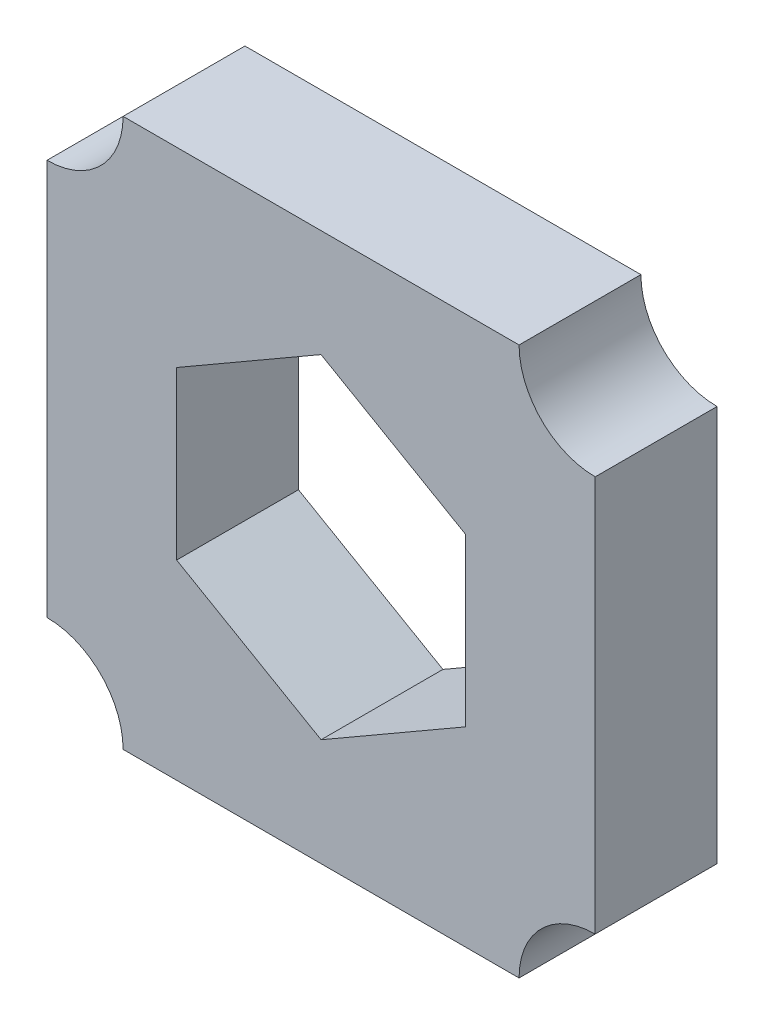
ISO-10303-21;
HEADER;
FILE_DESCRIPTION(('STEP AP214'),'2;1');
FILE_NAME('part.step','',(''),(''),'','','');
FILE_SCHEMA(('AUTOMOTIVE_DESIGN { 1 0 10303 214 1 1 1 1 }'));
ENDSEC;
DATA;
#1=APPLICATION_CONTEXT('core data for automotive mechanical design processes');
#2=APPLICATION_PROTOCOL_DEFINITION('international standard','automotive_design',2000,#1);
#3=PRODUCT_CONTEXT('',#1,'mechanical');
#4=PRODUCT('Part','Part','',(#3));
#5=PRODUCT_RELATED_PRODUCT_CATEGORY('part','',(#4));
#6=PRODUCT_DEFINITION_FORMATION('','',#4);
#7=PRODUCT_DEFINITION_CONTEXT('part definition',#1,'design');
#8=PRODUCT_DEFINITION('design','',#6,#7);
#9=PRODUCT_DEFINITION_SHAPE('','',#8);
#10=(LENGTH_UNIT() NAMED_UNIT(*) SI_UNIT(.MILLI.,.METRE.));
#11=(NAMED_UNIT(*) PLANE_ANGLE_UNIT() SI_UNIT($,.RADIAN.));
#12=(NAMED_UNIT(*) SI_UNIT($,.STERADIAN.) SOLID_ANGLE_UNIT());
#13=UNCERTAINTY_MEASURE_WITH_UNIT(LENGTH_MEASURE(1.E-05),#10,'distance_accuracy_value','');
#14=(GEOMETRIC_REPRESENTATION_CONTEXT(3) GLOBAL_UNCERTAINTY_ASSIGNED_CONTEXT((#13)) GLOBAL_UNIT_ASSIGNED_CONTEXT((#10,
#11,#12)) REPRESENTATION_CONTEXT('',''));
#15=CARTESIAN_POINT('',(0.,0.,0.));
#16=DIRECTION('',(0.,0.,1.));
#17=DIRECTION('',(1.,0.,0.));
#18=AXIS2_PLACEMENT_3D('',#15,#16,#17);
#19=CARTESIAN_POINT('',(90.,90.,10.));
#20=DIRECTION('',(0.,0.,1.));
#21=DIRECTION('',(1.,0.,0.));
#22=AXIS2_PLACEMENT_3D('',#19,#20,#21);
#23=PLANE('',#22);
#24=CARTESIAN_POINT('',(90.,90.,10.));
#25=DIRECTION('',(0.,0.,-1.));
#26=DIRECTION('',(1.,0.,0.));
#27=AXIS2_PLACEMENT_3D('',#24,#25,#26);
#28=CIRCLE('',#27,12.5);
#29=CARTESIAN_POINT('',(90.,77.5,10.));
#30=VERTEX_POINT('',#29);
#31=CARTESIAN_POINT('',(77.5,90.,10.));
#32=VERTEX_POINT('',#31);
#33=EDGE_CURVE('E185',#30,#32,#28,.T.);
#34=ORIENTED_EDGE('',*,*,#33,.T.);
#35=DIRECTION('',(-1.,0.,0.));
#36=VECTOR('',#35,1.);
#37=CARTESIAN_POINT('',(12.5,90.,10.));
#38=LINE('',#37,#36);
#39=CARTESIAN_POINT('',(12.5,90.,10.));
#40=VERTEX_POINT('',#39);
#41=EDGE_CURVE('E188',#32,#40,#38,.T.);
#42=ORIENTED_EDGE('',*,*,#41,.T.);
#43=CARTESIAN_POINT('',(0.,90.,10.));
#44=DIRECTION('',(0.,0.,-1.));
#45=DIRECTION('',(1.,0.,0.));
#46=AXIS2_PLACEMENT_3D('',#43,#44,#45);
#47=CIRCLE('',#46,12.5);
#48=CARTESIAN_POINT('',(0.,77.5,10.));
#49=VERTEX_POINT('',#48);
#50=EDGE_CURVE('E191',#40,#49,#47,.T.);
#51=ORIENTED_EDGE('',*,*,#50,.T.);
#52=DIRECTION('',(0.,-1.,0.));
#53=VECTOR('',#52,1.);
#54=CARTESIAN_POINT('',(0.,12.5,10.));
#55=LINE('',#54,#53);
#56=CARTESIAN_POINT('',(0.,12.5,10.));
#57=VERTEX_POINT('',#56);
#58=EDGE_CURVE('E193',#49,#57,#55,.T.);
#59=ORIENTED_EDGE('',*,*,#58,.T.);
#60=CARTESIAN_POINT('',(0.,0.,10.));
#61=DIRECTION('',(0.,0.,-1.));
#62=DIRECTION('',(1.,0.,0.));
#63=AXIS2_PLACEMENT_3D('',#60,#61,#62);
#64=CIRCLE('',#63,12.5);
#65=CARTESIAN_POINT('',(12.5,0.,10.));
#66=VERTEX_POINT('',#65);
#67=EDGE_CURVE('E195',#57,#66,#64,.T.);
#68=ORIENTED_EDGE('',*,*,#67,.T.);
#69=DIRECTION('',(1.,0.,0.));
#70=VECTOR('',#69,1.);
#71=CARTESIAN_POINT('',(12.5,0.,10.));
#72=LINE('',#71,#70);
#73=CARTESIAN_POINT('',(77.5,0.,10.));
#74=VERTEX_POINT('',#73);
#75=EDGE_CURVE('E197',#66,#74,#72,.T.);
#76=ORIENTED_EDGE('',*,*,#75,.T.);
#77=CARTESIAN_POINT('',(90.,0.,10.));
#78=DIRECTION('',(0.,0.,-1.));
#79=DIRECTION('',(1.,0.,0.));
#80=AXIS2_PLACEMENT_3D('',#77,#78,#79);
#81=CIRCLE('',#80,12.5);
#82=CARTESIAN_POINT('',(90.,12.5,10.));
#83=VERTEX_POINT('',#82);
#84=EDGE_CURVE('E199',#74,#83,#81,.T.);
#85=ORIENTED_EDGE('',*,*,#84,.T.);
#86=DIRECTION('',(0.,1.,0.));
#87=VECTOR('',#86,1.);
#88=CARTESIAN_POINT('',(90.,12.5,10.));
#89=LINE('',#88,#87);
#90=EDGE_CURVE('E201',#83,#30,#89,.T.);
#91=ORIENTED_EDGE('',*,*,#90,.T.);
#92=EDGE_LOOP('',(#34,#42,#51,#59,#68,#76,#85,#91));
#93=FACE_BOUND('',#92,.T.);
#94=DIRECTION('',(-0.866025403784438,-0.5,0.));
#95=VECTOR('',#94,1.);
#96=CARTESIAN_POINT('',(45.,72.3781512605043,10.));
#97=LINE('',#96,#95);
#98=CARTESIAN_POINT('',(45.,72.3781512605043,10.));
#99=VERTEX_POINT('',#98);
#100=CARTESIAN_POINT('',(21.2898254997503,58.6890756302522,10.));
#101=VERTEX_POINT('',#100);
#102=EDGE_CURVE('E142',#99,#101,#97,.T.);
#103=ORIENTED_EDGE('',*,*,#102,.F.);
#104=DIRECTION('',(-0.866025403784439,0.5,0.));
#105=VECTOR('',#104,1.);
#106=CARTESIAN_POINT('',(68.7101745002497,58.6890756302522,10.));
#107=LINE('',#106,#105);
#108=CARTESIAN_POINT('',(68.7101745002497,58.6890756302522,10.));
#109=VERTEX_POINT('',#108);
#110=EDGE_CURVE('E134',#109,#99,#107,.T.);
#111=ORIENTED_EDGE('',*,*,#110,.F.);
#112=DIRECTION('',(0.,1.,0.));
#113=VECTOR('',#112,1.);
#114=CARTESIAN_POINT('',(68.7101745002497,31.3109243697478,10.));
#115=LINE('',#114,#113);
#116=CARTESIAN_POINT('',(68.7101745002497,31.3109243697478,10.));
#117=VERTEX_POINT('',#116);
#118=EDGE_CURVE('E163',#117,#109,#115,.T.);
#119=ORIENTED_EDGE('',*,*,#118,.F.);
#120=DIRECTION('',(0.866025403784438,0.5,0.));
#121=VECTOR('',#120,1.);
#122=CARTESIAN_POINT('',(45.,17.6218487394956,10.));
#123=LINE('',#122,#121);
#124=CARTESIAN_POINT('',(45.,17.6218487394956,10.));
#125=VERTEX_POINT('',#124);
#126=EDGE_CURVE('E161',#125,#117,#123,.T.);
#127=ORIENTED_EDGE('',*,*,#126,.F.);
#128=DIRECTION('',(0.866025403784438,-0.5,0.));
#129=VECTOR('',#128,1.);
#130=CARTESIAN_POINT('',(21.2898254997503,31.3109243697478,10.));
#131=LINE('',#130,#129);
#132=CARTESIAN_POINT('',(21.2898254997503,31.3109243697478,10.));
#133=VERTEX_POINT('',#132);
#134=EDGE_CURVE('E157',#133,#125,#131,.T.);
#135=ORIENTED_EDGE('',*,*,#134,.F.);
#136=DIRECTION('',(0.,-1.,0.));
#137=VECTOR('',#136,1.);
#138=CARTESIAN_POINT('',(21.2898254997503,58.6890756302522,10.));
#139=LINE('',#138,#137);
#140=EDGE_CURVE('E155',#101,#133,#139,.T.);
#141=ORIENTED_EDGE('',*,*,#140,.F.);
#142=EDGE_LOOP('',(#103,#111,#119,#127,#135,#141));
#143=FACE_BOUND('',#142,.T.);
#144=ADVANCED_FACE('F33',(#93,#143),#23,.T.);
#145=CARTESIAN_POINT('',(90.,90.,-10.));
#146=DIRECTION('',(0.,0.,1.));
#147=DIRECTION('',(1.,0.,0.));
#148=AXIS2_PLACEMENT_3D('',#145,#146,#147);
#149=PLANE('',#148);
#150=CARTESIAN_POINT('',(90.,90.,-10.));
#151=DIRECTION('',(0.,0.,-1.));
#152=DIRECTION('',(1.,0.,0.));
#153=AXIS2_PLACEMENT_3D('',#150,#151,#152);
#154=CIRCLE('',#153,12.5);
#155=CARTESIAN_POINT('',(90.,77.5,-10.));
#156=VERTEX_POINT('',#155);
#157=CARTESIAN_POINT('',(77.5,90.,-10.));
#158=VERTEX_POINT('',#157);
#159=EDGE_CURVE('E150',#156,#158,#154,.T.);
#160=ORIENTED_EDGE('',*,*,#159,.F.);
#161=DIRECTION('',(0.,1.,0.));
#162=VECTOR('',#161,1.);
#163=CARTESIAN_POINT('',(90.,12.5,-10.));
#164=LINE('',#163,#162);
#165=CARTESIAN_POINT('',(90.,12.5,-10.));
#166=VERTEX_POINT('',#165);
#167=EDGE_CURVE('E189',#166,#156,#164,.T.);
#168=ORIENTED_EDGE('',*,*,#167,.F.);
#169=CARTESIAN_POINT('',(90.,0.,-10.));
#170=DIRECTION('',(0.,0.,-1.));
#171=DIRECTION('',(1.,0.,0.));
#172=AXIS2_PLACEMENT_3D('',#169,#170,#171);
#173=CIRCLE('',#172,12.5);
#174=CARTESIAN_POINT('',(77.5,0.,-10.));
#175=VERTEX_POINT('',#174);
#176=EDGE_CURVE('E216',#175,#166,#173,.T.);
#177=ORIENTED_EDGE('',*,*,#176,.F.);
#178=DIRECTION('',(1.,0.,0.));
#179=VECTOR('',#178,1.);
#180=CARTESIAN_POINT('',(12.5,0.,-10.));
#181=LINE('',#180,#179);
#182=CARTESIAN_POINT('',(12.5,0.,-10.));
#183=VERTEX_POINT('',#182);
#184=EDGE_CURVE('E214',#183,#175,#181,.T.);
#185=ORIENTED_EDGE('',*,*,#184,.F.);
#186=CARTESIAN_POINT('',(0.,0.,-10.));
#187=DIRECTION('',(0.,0.,-1.));
#188=DIRECTION('',(1.,0.,0.));
#189=AXIS2_PLACEMENT_3D('',#186,#187,#188);
#190=CIRCLE('',#189,12.5);
#191=CARTESIAN_POINT('',(0.,12.5,-10.));
#192=VERTEX_POINT('',#191);
#193=EDGE_CURVE('E212',#192,#183,#190,.T.);
#194=ORIENTED_EDGE('',*,*,#193,.F.);
#195=DIRECTION('',(0.,-1.,0.));
#196=VECTOR('',#195,1.);
#197=CARTESIAN_POINT('',(0.,12.5,-10.));
#198=LINE('',#197,#196);
#199=CARTESIAN_POINT('',(0.,77.5,-10.));
#200=VERTEX_POINT('',#199);
#201=EDGE_CURVE('E210',#200,#192,#198,.T.);
#202=ORIENTED_EDGE('',*,*,#201,.F.);
#203=CARTESIAN_POINT('',(0.,90.,-10.));
#204=DIRECTION('',(0.,0.,-1.));
#205=DIRECTION('',(1.,0.,0.));
#206=AXIS2_PLACEMENT_3D('',#203,#204,#205);
#207=CIRCLE('',#206,12.5);
#208=CARTESIAN_POINT('',(12.5,90.,-10.));
#209=VERTEX_POINT('',#208);
#210=EDGE_CURVE('E208',#209,#200,#207,.T.);
#211=ORIENTED_EDGE('',*,*,#210,.F.);
#212=DIRECTION('',(-1.,0.,0.));
#213=VECTOR('',#212,1.);
#214=CARTESIAN_POINT('',(12.5,90.,-10.));
#215=LINE('',#214,#213);
#216=EDGE_CURVE('E206',#158,#209,#215,.T.);
#217=ORIENTED_EDGE('',*,*,#216,.F.);
#218=EDGE_LOOP('',(#160,#168,#177,#185,#194,#202,#211,#217));
#219=FACE_BOUND('',#218,.T.);
#220=DIRECTION('',(-0.866025403784439,0.5,0.));
#221=VECTOR('',#220,1.);
#222=CARTESIAN_POINT('',(68.7101745002497,58.6890756302522,-10.));
#223=LINE('',#222,#221);
#224=CARTESIAN_POINT('',(68.7101745002497,58.6890756302522,-10.));
#225=VERTEX_POINT('',#224);
#226=CARTESIAN_POINT('',(45.,72.3781512605043,-10.));
#227=VERTEX_POINT('',#226);
#228=EDGE_CURVE('E56',#225,#227,#223,.T.);
#229=ORIENTED_EDGE('',*,*,#228,.T.);
#230=DIRECTION('',(-0.866025403784438,-0.5,0.));
#231=VECTOR('',#230,1.);
#232=CARTESIAN_POINT('',(45.,72.3781512605043,-10.));
#233=LINE('',#232,#231);
#234=CARTESIAN_POINT('',(21.2898254997503,58.6890756302522,-10.));
#235=VERTEX_POINT('',#234);
#236=EDGE_CURVE('E149',#227,#235,#233,.T.);
#237=ORIENTED_EDGE('',*,*,#236,.T.);
#238=DIRECTION('',(0.,-1.,0.));
#239=VECTOR('',#238,1.);
#240=CARTESIAN_POINT('',(21.2898254997503,58.6890756302522,-10.));
#241=LINE('',#240,#239);
#242=CARTESIAN_POINT('',(21.2898254997503,31.3109243697478,-10.));
#243=VERTEX_POINT('',#242);
#244=EDGE_CURVE('E167',#235,#243,#241,.T.);
#245=ORIENTED_EDGE('',*,*,#244,.T.);
#246=DIRECTION('',(0.866025403784438,-0.5,0.));
#247=VECTOR('',#246,1.);
#248=CARTESIAN_POINT('',(21.2898254997503,31.3109243697478,-10.));
#249=LINE('',#248,#247);
#250=CARTESIAN_POINT('',(45.,17.6218487394956,-10.));
#251=VERTEX_POINT('',#250);
#252=EDGE_CURVE('E170',#243,#251,#249,.T.);
#253=ORIENTED_EDGE('',*,*,#252,.T.);
#254=DIRECTION('',(0.866025403784438,0.5,0.));
#255=VECTOR('',#254,1.);
#256=CARTESIAN_POINT('',(45.,17.6218487394956,-10.));
#257=LINE('',#256,#255);
#258=CARTESIAN_POINT('',(68.7101745002497,31.3109243697478,-10.));
#259=VERTEX_POINT('',#258);
#260=EDGE_CURVE('E173',#251,#259,#257,.T.);
#261=ORIENTED_EDGE('',*,*,#260,.T.);
#262=DIRECTION('',(0.,1.,0.));
#263=VECTOR('',#262,1.);
#264=CARTESIAN_POINT('',(68.7101745002497,31.3109243697478,-10.));
#265=LINE('',#264,#263);
#266=EDGE_CURVE('E143',#259,#225,#265,.T.);
#267=ORIENTED_EDGE('',*,*,#266,.T.);
#268=EDGE_LOOP('',(#229,#237,#245,#253,#261,#267));
#269=FACE_BOUND('',#268,.T.);
#270=ADVANCED_FACE('F246',(#219,#269),#149,.F.);
#271=CARTESIAN_POINT('',(90.,90.,10.));
#272=DIRECTION('',(0.,0.,-1.));
#273=DIRECTION('',(-1.,0.,0.));
#274=AXIS2_PLACEMENT_3D('',#271,#272,#273);
#275=CYLINDRICAL_SURFACE('',#274,12.5);
#276=ORIENTED_EDGE('',*,*,#159,.T.);
#277=DIRECTION('',(0.,0.,-1.));
#278=VECTOR('',#277,1.);
#279=CARTESIAN_POINT('',(77.5,90.,10.));
#280=LINE('',#279,#278);
#281=EDGE_CURVE('E11',#32,#158,#280,.T.);
#282=ORIENTED_EDGE('',*,*,#281,.F.);
#283=ORIENTED_EDGE('',*,*,#33,.F.);
#284=DIRECTION('',(0.,0.,-1.));
#285=VECTOR('',#284,1.);
#286=CARTESIAN_POINT('',(90.,77.5,10.));
#287=LINE('',#286,#285);
#288=EDGE_CURVE('E203',#30,#156,#287,.T.);
#289=ORIENTED_EDGE('',*,*,#288,.T.);
#290=EDGE_LOOP('',(#276,#282,#283,#289));
#291=FACE_BOUND('',#290,.T.);
#292=ADVANCED_FACE('F35',(#291),#275,.F.);
#293=CARTESIAN_POINT('',(12.5,90.,10.));
#294=DIRECTION('',(0.,-1.,0.));
#295=DIRECTION('',(0.,0.,-1.));
#296=AXIS2_PLACEMENT_3D('',#293,#294,#295);
#297=PLANE('',#296);
#298=ORIENTED_EDGE('',*,*,#216,.T.);
#299=DIRECTION('',(0.,0.,-1.));
#300=VECTOR('',#299,1.);
#301=CARTESIAN_POINT('',(12.5,90.,10.));
#302=LINE('',#301,#300);
#303=EDGE_CURVE('E41',#40,#209,#302,.T.);
#304=ORIENTED_EDGE('',*,*,#303,.F.);
#305=ORIENTED_EDGE('',*,*,#41,.F.);
#306=ORIENTED_EDGE('',*,*,#281,.T.);
#307=EDGE_LOOP('',(#298,#304,#305,#306));
#308=FACE_BOUND('',#307,.T.);
#309=ADVANCED_FACE('F263',(#308),#297,.F.);
#310=CARTESIAN_POINT('',(0.,90.,10.));
#311=DIRECTION('',(0.,0.,-1.));
#312=DIRECTION('',(-1.,0.,0.));
#313=AXIS2_PLACEMENT_3D('',#310,#311,#312);
#314=CYLINDRICAL_SURFACE('',#313,12.5);
#315=ORIENTED_EDGE('',*,*,#210,.T.);
#316=DIRECTION('',(0.,0.,-1.));
#317=VECTOR('',#316,1.);
#318=CARTESIAN_POINT('',(0.,77.5,10.));
#319=LINE('',#318,#317);
#320=EDGE_CURVE('E233',#49,#200,#319,.T.);
#321=ORIENTED_EDGE('',*,*,#320,.F.);
#322=ORIENTED_EDGE('',*,*,#50,.F.);
#323=ORIENTED_EDGE('',*,*,#303,.T.);
#324=EDGE_LOOP('',(#315,#321,#322,#323));
#325=FACE_BOUND('',#324,.T.);
#326=ADVANCED_FACE('F240',(#325),#314,.F.);
#327=CARTESIAN_POINT('',(0.,12.5,10.));
#328=DIRECTION('',(1.,0.,0.));
#329=DIRECTION('',(0.,0.,-1.));
#330=AXIS2_PLACEMENT_3D('',#327,#328,#329);
#331=PLANE('',#330);
#332=ORIENTED_EDGE('',*,*,#201,.T.);
#333=DIRECTION('',(0.,0.,-1.));
#334=VECTOR('',#333,1.);
#335=CARTESIAN_POINT('',(0.,12.5,10.));
#336=LINE('',#335,#334);
#337=EDGE_CURVE('E230',#57,#192,#336,.T.);
#338=ORIENTED_EDGE('',*,*,#337,.F.);
#339=ORIENTED_EDGE('',*,*,#58,.F.);
#340=ORIENTED_EDGE('',*,*,#320,.T.);
#341=EDGE_LOOP('',(#332,#338,#339,#340));
#342=FACE_BOUND('',#341,.T.);
#343=ADVANCED_FACE('F252',(#342),#331,.F.);
#344=CARTESIAN_POINT('',(0.,0.,10.));
#345=DIRECTION('',(0.,0.,-1.));
#346=DIRECTION('',(-1.,0.,0.));
#347=AXIS2_PLACEMENT_3D('',#344,#345,#346);
#348=CYLINDRICAL_SURFACE('',#347,12.5);
#349=ORIENTED_EDGE('',*,*,#193,.T.);
#350=DIRECTION('',(0.,0.,-1.));
#351=VECTOR('',#350,1.);
#352=CARTESIAN_POINT('',(12.5,0.,10.));
#353=LINE('',#352,#351);
#354=EDGE_CURVE('E227',#66,#183,#353,.T.);
#355=ORIENTED_EDGE('',*,*,#354,.F.);
#356=ORIENTED_EDGE('',*,*,#67,.F.);
#357=ORIENTED_EDGE('',*,*,#337,.T.);
#358=EDGE_LOOP('',(#349,#355,#356,#357));
#359=FACE_BOUND('',#358,.T.);
#360=ADVANCED_FACE('F256',(#359),#348,.F.);
#361=CARTESIAN_POINT('',(12.5,0.,10.));
#362=DIRECTION('',(0.,1.,0.));
#363=DIRECTION('',(-1.,0.,0.));
#364=AXIS2_PLACEMENT_3D('',#361,#362,#363);
#365=PLANE('',#364);
#366=ORIENTED_EDGE('',*,*,#184,.T.);
#367=DIRECTION('',(0.,0.,-1.));
#368=VECTOR('',#367,1.);
#369=CARTESIAN_POINT('',(77.5,0.,10.));
#370=LINE('',#369,#368);
#371=EDGE_CURVE('E224',#74,#175,#370,.T.);
#372=ORIENTED_EDGE('',*,*,#371,.F.);
#373=ORIENTED_EDGE('',*,*,#75,.F.);
#374=ORIENTED_EDGE('',*,*,#354,.T.);
#375=EDGE_LOOP('',(#366,#372,#373,#374));
#376=FACE_BOUND('',#375,.T.);
#377=ADVANCED_FACE('F276',(#376),#365,.F.);
#378=CARTESIAN_POINT('',(90.,0.,10.));
#379=DIRECTION('',(0.,0.,-1.));
#380=DIRECTION('',(-1.,0.,0.));
#381=AXIS2_PLACEMENT_3D('',#378,#379,#380);
#382=CYLINDRICAL_SURFACE('',#381,12.5);
#383=ORIENTED_EDGE('',*,*,#176,.T.);
#384=DIRECTION('',(0.,0.,-1.));
#385=VECTOR('',#384,1.);
#386=CARTESIAN_POINT('',(90.,12.5,10.));
#387=LINE('',#386,#385);
#388=EDGE_CURVE('E221',#83,#166,#387,.T.);
#389=ORIENTED_EDGE('',*,*,#388,.F.);
#390=ORIENTED_EDGE('',*,*,#84,.F.);
#391=ORIENTED_EDGE('',*,*,#371,.T.);
#392=EDGE_LOOP('',(#383,#389,#390,#391));
#393=FACE_BOUND('',#392,.T.);
#394=ADVANCED_FACE('F274',(#393),#382,.F.);
#395=CARTESIAN_POINT('',(90.,12.5,10.));
#396=DIRECTION('',(-1.,0.,0.));
#397=DIRECTION('',(0.,0.,1.));
#398=AXIS2_PLACEMENT_3D('',#395,#396,#397);
#399=PLANE('',#398);
#400=ORIENTED_EDGE('',*,*,#167,.T.);
#401=ORIENTED_EDGE('',*,*,#288,.F.);
#402=ORIENTED_EDGE('',*,*,#90,.F.);
#403=ORIENTED_EDGE('',*,*,#388,.T.);
#404=EDGE_LOOP('',(#400,#401,#402,#403));
#405=FACE_BOUND('',#404,.T.);
#406=ADVANCED_FACE('F269',(#405),#399,.F.);
#407=CARTESIAN_POINT('',(68.7101745002497,58.6890756302522,10.));
#408=DIRECTION('',(-0.5,-0.866025403784439,0.));
#409=DIRECTION('',(0.866025403784439,-0.5,0.));
#410=AXIS2_PLACEMENT_3D('',#407,#408,#409);
#411=PLANE('',#410);
#412=ORIENTED_EDGE('',*,*,#228,.F.);
#413=DIRECTION('',(0.,0.,-1.));
#414=VECTOR('',#413,1.);
#415=CARTESIAN_POINT('',(68.7101745002497,58.6890756302522,10.));
#416=LINE('',#415,#414);
#417=EDGE_CURVE('E138',#109,#225,#416,.T.);
#418=ORIENTED_EDGE('',*,*,#417,.F.);
#419=ORIENTED_EDGE('',*,*,#110,.T.);
#420=DIRECTION('',(0.,0.,-1.));
#421=VECTOR('',#420,1.);
#422=CARTESIAN_POINT('',(45.,72.3781512605043,10.));
#423=LINE('',#422,#421);
#424=EDGE_CURVE('E137',#99,#227,#423,.T.);
#425=ORIENTED_EDGE('',*,*,#424,.T.);
#426=EDGE_LOOP('',(#412,#418,#419,#425));
#427=FACE_BOUND('',#426,.T.);
#428=ADVANCED_FACE('F136',(#427),#411,.T.);
#429=CARTESIAN_POINT('',(45.,72.3781512605043,10.));
#430=DIRECTION('',(0.5,-0.866025403784438,0.));
#431=DIRECTION('',(0.866025403784439,0.5,0.));
#432=AXIS2_PLACEMENT_3D('',#429,#430,#431);
#433=PLANE('',#432);
#434=ORIENTED_EDGE('',*,*,#236,.F.);
#435=ORIENTED_EDGE('',*,*,#424,.F.);
#436=ORIENTED_EDGE('',*,*,#102,.T.);
#437=DIRECTION('',(0.,0.,-1.));
#438=VECTOR('',#437,1.);
#439=CARTESIAN_POINT('',(21.2898254997503,58.6890756302522,10.));
#440=LINE('',#439,#438);
#441=EDGE_CURVE('E151',#101,#235,#440,.T.);
#442=ORIENTED_EDGE('',*,*,#441,.T.);
#443=EDGE_LOOP('',(#434,#435,#436,#442));
#444=FACE_BOUND('',#443,.T.);
#445=ADVANCED_FACE('F146',(#444),#433,.T.);
#446=CARTESIAN_POINT('',(21.2898254997503,58.6890756302522,10.));
#447=DIRECTION('',(1.,0.,0.));
#448=DIRECTION('',(0.,0.,-1.));
#449=AXIS2_PLACEMENT_3D('',#446,#447,#448);
#450=PLANE('',#449);
#451=ORIENTED_EDGE('',*,*,#244,.F.);
#452=ORIENTED_EDGE('',*,*,#441,.F.);
#453=ORIENTED_EDGE('',*,*,#140,.T.);
#454=DIRECTION('',(0.,0.,-1.));
#455=VECTOR('',#454,1.);
#456=CARTESIAN_POINT('',(21.2898254997503,31.3109243697478,10.));
#457=LINE('',#456,#455);
#458=EDGE_CURVE('E182',#133,#243,#457,.T.);
#459=ORIENTED_EDGE('',*,*,#458,.T.);
#460=EDGE_LOOP('',(#451,#452,#453,#459));
#461=FACE_BOUND('',#460,.T.);
#462=ADVANCED_FACE('F301',(#461),#450,.T.);
#463=CARTESIAN_POINT('',(21.2898254997503,31.3109243697478,10.));
#464=DIRECTION('',(0.5,0.866025403784438,0.));
#465=DIRECTION('',(-0.866025403784439,0.5,0.));
#466=AXIS2_PLACEMENT_3D('',#463,#464,#465);
#467=PLANE('',#466);
#468=ORIENTED_EDGE('',*,*,#252,.F.);
#469=ORIENTED_EDGE('',*,*,#458,.F.);
#470=ORIENTED_EDGE('',*,*,#134,.T.);
#471=DIRECTION('',(0.,0.,-1.));
#472=VECTOR('',#471,1.);
#473=CARTESIAN_POINT('',(45.,17.6218487394956,10.));
#474=LINE('',#473,#472);
#475=EDGE_CURVE('E180',#125,#251,#474,.T.);
#476=ORIENTED_EDGE('',*,*,#475,.T.);
#477=EDGE_LOOP('',(#468,#469,#470,#476));
#478=FACE_BOUND('',#477,.T.);
#479=ADVANCED_FACE('F305',(#478),#467,.T.);
#480=CARTESIAN_POINT('',(45.,17.6218487394956,10.));
#481=DIRECTION('',(-0.5,0.866025403784438,0.));
#482=DIRECTION('',(-0.866025403784439,-0.5,0.));
#483=AXIS2_PLACEMENT_3D('',#480,#481,#482);
#484=PLANE('',#483);
#485=ORIENTED_EDGE('',*,*,#260,.F.);
#486=ORIENTED_EDGE('',*,*,#475,.F.);
#487=ORIENTED_EDGE('',*,*,#126,.T.);
#488=DIRECTION('',(0.,0.,-1.));
#489=VECTOR('',#488,1.);
#490=CARTESIAN_POINT('',(68.7101745002497,31.3109243697478,10.));
#491=LINE('',#490,#489);
#492=EDGE_CURVE('E48',#117,#259,#491,.T.);
#493=ORIENTED_EDGE('',*,*,#492,.T.);
#494=EDGE_LOOP('',(#485,#486,#487,#493));
#495=FACE_BOUND('',#494,.T.);
#496=ADVANCED_FACE('F311',(#495),#484,.T.);
#497=CARTESIAN_POINT('',(68.7101745002497,31.3109243697478,10.));
#498=DIRECTION('',(-1.,0.,0.));
#499=DIRECTION('',(0.,0.,1.));
#500=AXIS2_PLACEMENT_3D('',#497,#498,#499);
#501=PLANE('',#500);
#502=ORIENTED_EDGE('',*,*,#266,.F.);
#503=ORIENTED_EDGE('',*,*,#492,.F.);
#504=ORIENTED_EDGE('',*,*,#118,.T.);
#505=ORIENTED_EDGE('',*,*,#417,.T.);
#506=EDGE_LOOP('',(#502,#503,#504,#505));
#507=FACE_BOUND('',#506,.T.);
#508=ADVANCED_FACE('F315',(#507),#501,.T.);
#509=CLOSED_SHELL('',(#144,#270,#292,#309,#326,#343,#360,#377,#394,#406,#428,#445,#462,#479,
#496,#508));
#510=MANIFOLD_SOLID_BREP('B2',#509);
#511=ADVANCED_BREP_SHAPE_REPRESENTATION('',(#18,#510),#14);
#512=SHAPE_DEFINITION_REPRESENTATION(#9,#511);
ENDSEC;
END-ISO-10303-21;
